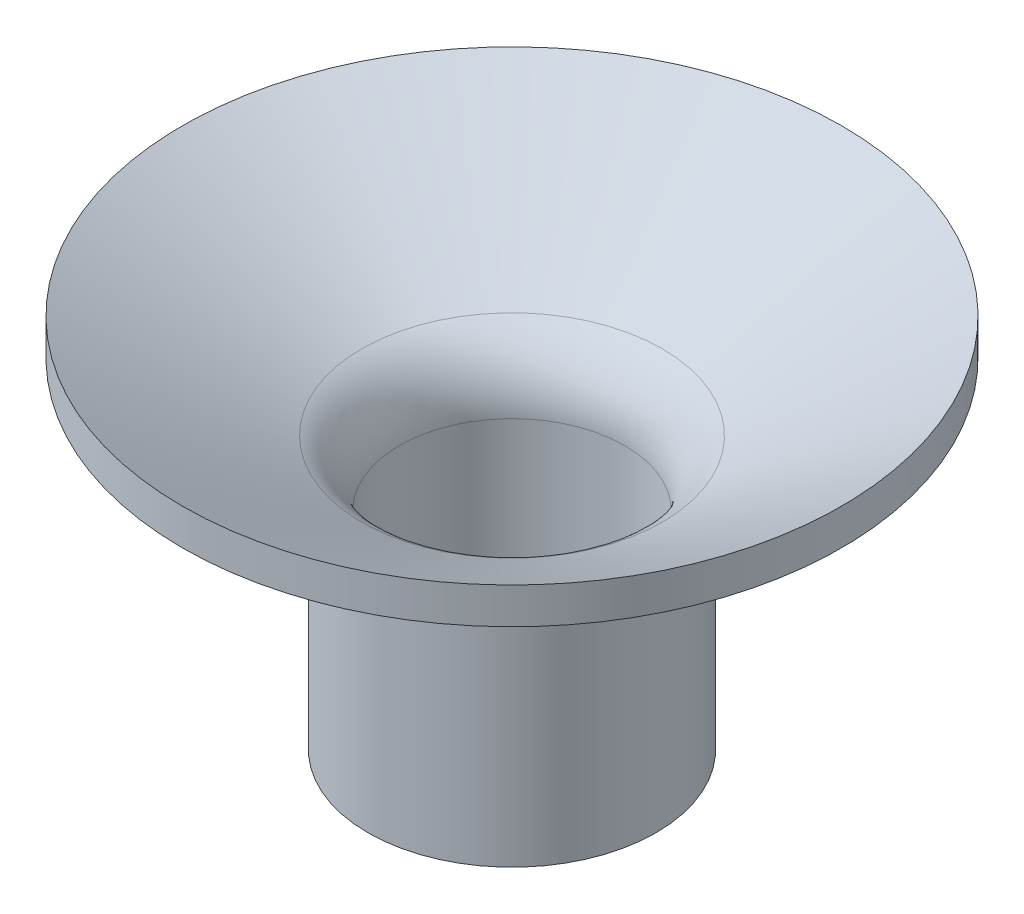
ISO-10303-21;
HEADER;
FILE_DESCRIPTION(('STEP AP214'),'2;1');
FILE_NAME('part.step','',(''),(''),'','','');
FILE_SCHEMA(('AUTOMOTIVE_DESIGN { 1 0 10303 214 1 1 1 1 }'));
ENDSEC;
DATA;
#1=APPLICATION_CONTEXT('core data for automotive mechanical design processes');
#2=APPLICATION_PROTOCOL_DEFINITION('international standard','automotive_design',2000,#1);
#3=PRODUCT_CONTEXT('',#1,'mechanical');
#4=PRODUCT('Part','Part','',(#3));
#5=PRODUCT_RELATED_PRODUCT_CATEGORY('part','',(#4));
#6=PRODUCT_DEFINITION_FORMATION('','',#4);
#7=PRODUCT_DEFINITION_CONTEXT('part definition',#1,'design');
#8=PRODUCT_DEFINITION('design','',#6,#7);
#9=PRODUCT_DEFINITION_SHAPE('','',#8);
#10=(LENGTH_UNIT() NAMED_UNIT(*) SI_UNIT(.MILLI.,.METRE.));
#11=(NAMED_UNIT(*) PLANE_ANGLE_UNIT() SI_UNIT($,.RADIAN.));
#12=(NAMED_UNIT(*) SI_UNIT($,.STERADIAN.) SOLID_ANGLE_UNIT());
#13=UNCERTAINTY_MEASURE_WITH_UNIT(LENGTH_MEASURE(1.E-05),#10,'distance_accuracy_value','');
#14=(GEOMETRIC_REPRESENTATION_CONTEXT(3) GLOBAL_UNCERTAINTY_ASSIGNED_CONTEXT((#13)) GLOBAL_UNIT_ASSIGNED_CONTEXT((#10,
#11,#12)) REPRESENTATION_CONTEXT('',''));
#15=CARTESIAN_POINT('',(0.,0.,0.));
#16=DIRECTION('',(0.,0.,1.));
#17=DIRECTION('',(1.,0.,0.));
#18=AXIS2_PLACEMENT_3D('',#15,#16,#17);
#19=CARTESIAN_POINT('',(0.,0.,11.5));
#20=DIRECTION('',(0.,1.,0.));
#21=DIRECTION('',(0.,0.,1.));
#22=AXIS2_PLACEMENT_3D('',#19,#20,#21);
#23=PLANE('',#22);
#24=CARTESIAN_POINT('',(0.,0.,0.));
#25=DIRECTION('',(0.,-1.,0.));
#26=DIRECTION('',(0.,0.,-1.));
#27=AXIS2_PLACEMENT_3D('',#24,#25,#26);
#28=CIRCLE('',#27,9.);
#29=CARTESIAN_POINT('',(0.,0.,-9.));
#30=VERTEX_POINT('',#29);
#31=EDGE_CURVE('E56',#30,#30,#28,.T.);
#32=ORIENTED_EDGE('',*,*,#31,.F.);
#33=EDGE_LOOP('',(#32));
#34=FACE_BOUND('',#33,.T.);
#35=CARTESIAN_POINT('',(0.,0.,0.));
#36=DIRECTION('',(0.,-1.,0.));
#37=DIRECTION('',(0.,0.,-1.));
#38=AXIS2_PLACEMENT_3D('',#35,#36,#37);
#39=CIRCLE('',#38,11.5);
#40=CARTESIAN_POINT('',(0.,0.,-11.5));
#41=VERTEX_POINT('',#40);
#42=EDGE_CURVE('E75',#41,#41,#39,.T.);
#43=ORIENTED_EDGE('',*,*,#42,.T.);
#44=EDGE_LOOP('',(#43));
#45=FACE_BOUND('',#44,.T.);
#46=ADVANCED_FACE('F43',(#34,#45),#23,.F.);
#47=CARTESIAN_POINT('',(0.,0.,0.));
#48=DIRECTION('',(0.,-1.,0.));
#49=DIRECTION('',(0.,0.,-1.));
#50=AXIS2_PLACEMENT_3D('',#47,#48,#49);
#51=CYLINDRICAL_SURFACE('',#50,9.);
#52=CARTESIAN_POINT('',(0.,16.5358983848622,0.));
#53=DIRECTION('',(0.,1.,0.));
#54=DIRECTION('',(0.,0.,1.));
#55=AXIS2_PLACEMENT_3D('',#52,#53,#54);
#56=CIRCLE('',#55,9.);
#57=CARTESIAN_POINT('',(0.,16.5358983848622,9.));
#58=VERTEX_POINT('',#57);
#59=EDGE_CURVE('E10',#58,#58,#56,.T.);
#60=ORIENTED_EDGE('',*,*,#59,.T.);
#61=EDGE_LOOP('',(#60));
#62=FACE_BOUND('',#61,.T.);
#63=ORIENTED_EDGE('',*,*,#31,.T.);
#64=EDGE_LOOP('',(#63));
#65=FACE_BOUND('',#64,.T.);
#66=ADVANCED_FACE('F101',(#62,#65),#51,.F.);
#67=CARTESIAN_POINT('',(0.,20.,0.));
#68=DIRECTION('',(0.,1.,0.));
#69=DIRECTION('',(0.,0.,1.));
#70=AXIS2_PLACEMENT_3D('',#67,#68,#69);
#71=CONICAL_SURFACE('',#70,9.,1.0471975511966);
#72=CARTESIAN_POINT('',(0.,21.7320508075689,0.));
#73=DIRECTION('',(0.,-1.,0.));
#74=DIRECTION('',(0.,0.,-1.));
#75=AXIS2_PLACEMENT_3D('',#72,#73,#74);
#76=CIRCLE('',#75,12.);
#77=CARTESIAN_POINT('',(0.,21.7320508075689,-12.));
#78=VERTEX_POINT('',#77);
#79=EDGE_CURVE('E51',#78,#78,#76,.T.);
#80=ORIENTED_EDGE('',*,*,#79,.T.);
#81=EDGE_LOOP('',(#80));
#82=FACE_BOUND('',#81,.T.);
#83=CARTESIAN_POINT('',(0.,30.,0.));
#84=DIRECTION('',(0.,-1.,0.));
#85=DIRECTION('',(0.,0.,-1.));
#86=AXIS2_PLACEMENT_3D('',#83,#84,#85);
#87=CIRCLE('',#86,26.3205080756888);
#88=CARTESIAN_POINT('',(0.,30.,-26.3205080756888));
#89=VERTEX_POINT('',#88);
#90=EDGE_CURVE('E61',#89,#89,#87,.T.);
#91=ORIENTED_EDGE('',*,*,#90,.F.);
#92=EDGE_LOOP('',(#91));
#93=FACE_BOUND('',#92,.T.);
#94=ADVANCED_FACE('F96',(#82,#93),#71,.F.);
#95=CARTESIAN_POINT('',(0.,0.,0.));
#96=DIRECTION('',(0.,-1.,0.));
#97=DIRECTION('',(0.,0.,-1.));
#98=AXIS2_PLACEMENT_3D('',#95,#96,#97);
#99=CYLINDRICAL_SURFACE('',#98,26.3205080756888);
#100=CARTESIAN_POINT('',(0.,27.1132486540518,0.));
#101=DIRECTION('',(0.,-1.,0.));
#102=DIRECTION('',(0.,0.,-1.));
#103=AXIS2_PLACEMENT_3D('',#100,#101,#102);
#104=CIRCLE('',#103,26.3205080756888);
#105=CARTESIAN_POINT('',(0.,27.1132486540518,-26.3205080756888));
#106=VERTEX_POINT('',#105);
#107=EDGE_CURVE('E67',#106,#106,#104,.T.);
#108=ORIENTED_EDGE('',*,*,#107,.F.);
#109=EDGE_LOOP('',(#108));
#110=FACE_BOUND('',#109,.T.);
#111=ORIENTED_EDGE('',*,*,#90,.T.);
#112=EDGE_LOOP('',(#111));
#113=FACE_BOUND('',#112,.T.);
#114=ADVANCED_FACE('F90',(#110,#113),#99,.T.);
#115=CARTESIAN_POINT('',(0.,27.1132486540518,0.));
#116=DIRECTION('',(0.,1.,0.));
#117=DIRECTION('',(0.,0.,1.));
#118=AXIS2_PLACEMENT_3D('',#115,#116,#117);
#119=CONICAL_SURFACE('',#118,26.3205080756888,1.0471975511966);
#120=CARTESIAN_POINT('',(0.,18.5566243270259,0.));
#121=DIRECTION('',(0.,-1.,0.));
#122=DIRECTION('',(0.,0.,-1.));
#123=AXIS2_PLACEMENT_3D('',#120,#121,#122);
#124=CIRCLE('',#123,11.5);
#125=CARTESIAN_POINT('',(0.,18.5566243270259,-11.5));
#126=VERTEX_POINT('',#125);
#127=EDGE_CURVE('E71',#126,#126,#124,.T.);
#128=ORIENTED_EDGE('',*,*,#127,.F.);
#129=EDGE_LOOP('',(#128));
#130=FACE_BOUND('',#129,.T.);
#131=ORIENTED_EDGE('',*,*,#107,.T.);
#132=EDGE_LOOP('',(#131));
#133=FACE_BOUND('',#132,.T.);
#134=ADVANCED_FACE('F84',(#130,#133),#119,.T.);
#135=CARTESIAN_POINT('',(0.,0.,0.));
#136=DIRECTION('',(0.,-1.,0.));
#137=DIRECTION('',(0.,0.,-1.));
#138=AXIS2_PLACEMENT_3D('',#135,#136,#137);
#139=CYLINDRICAL_SURFACE('',#138,11.5);
#140=ORIENTED_EDGE('',*,*,#42,.F.);
#141=EDGE_LOOP('',(#140));
#142=FACE_BOUND('',#141,.T.);
#143=ORIENTED_EDGE('',*,*,#127,.T.);
#144=EDGE_LOOP('',(#143));
#145=FACE_BOUND('',#144,.T.);
#146=ADVANCED_FACE('F81',(#142,#145),#139,.T.);
#147=CARTESIAN_POINT('',(0.,16.5358983848622,0.));
#148=DIRECTION('',(0.,1.,0.));
#149=DIRECTION('',(0.,0.,1.));
#150=AXIS2_PLACEMENT_3D('',#147,#148,#149);
#151=TOROIDAL_SURFACE('',#150,15.,6.);
#152=ORIENTED_EDGE('',*,*,#59,.F.);
#153=EDGE_LOOP('',(#152));
#154=FACE_BOUND('',#153,.T.);
#155=ORIENTED_EDGE('',*,*,#79,.F.);
#156=EDGE_LOOP('',(#155));
#157=FACE_BOUND('',#156,.T.);
#158=ADVANCED_FACE('F45',(#154,#157),#151,.T.);
#159=CLOSED_SHELL('',(#46,#66,#94,#114,#134,#146,#158));
#160=MANIFOLD_SOLID_BREP('B2',#159);
#161=ADVANCED_BREP_SHAPE_REPRESENTATION('',(#18,#160),#14);
#162=SHAPE_DEFINITION_REPRESENTATION(#9,#161);
ENDSEC;
END-ISO-10303-21;
